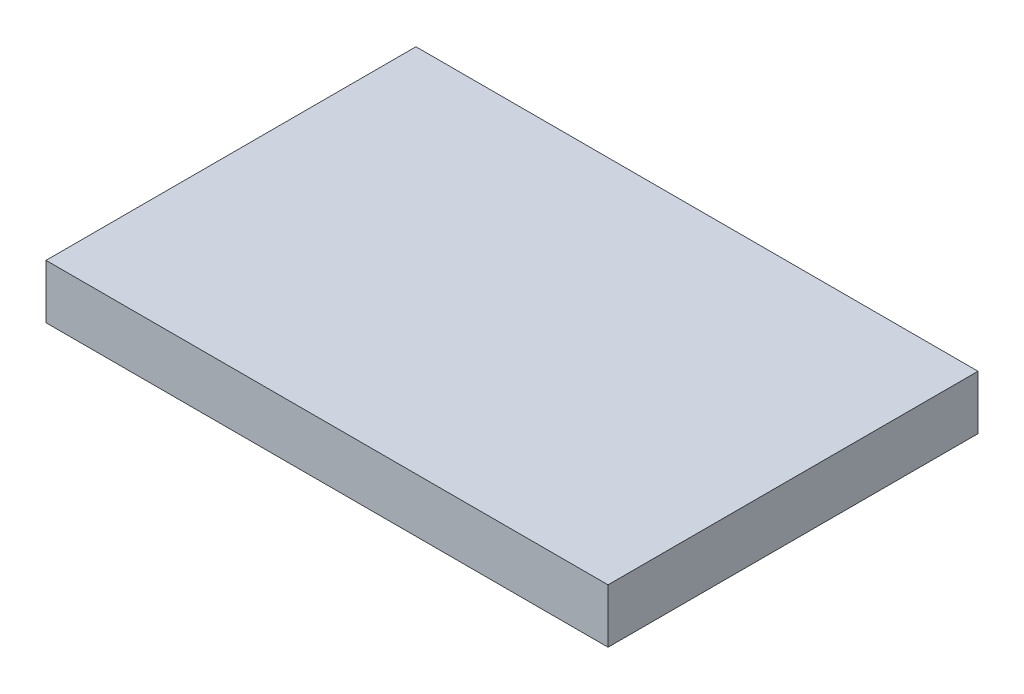
ISO-10303-21;
HEADER;
FILE_DESCRIPTION(('STEP AP214'),'2;1');
FILE_NAME('part.step','',(''),(''),'','','');
FILE_SCHEMA(('AUTOMOTIVE_DESIGN { 1 0 10303 214 1 1 1 1 }'));
ENDSEC;
DATA;
#1=APPLICATION_CONTEXT('core data for automotive mechanical design processes');
#2=APPLICATION_PROTOCOL_DEFINITION('international standard','automotive_design',2000,#1);
#3=PRODUCT_CONTEXT('',#1,'mechanical');
#4=PRODUCT('Part','Part','',(#3));
#5=PRODUCT_RELATED_PRODUCT_CATEGORY('part','',(#4));
#6=PRODUCT_DEFINITION_FORMATION('','',#4);
#7=PRODUCT_DEFINITION_CONTEXT('part definition',#1,'design');
#8=PRODUCT_DEFINITION('design','',#6,#7);
#9=PRODUCT_DEFINITION_SHAPE('','',#8);
#10=(LENGTH_UNIT() NAMED_UNIT(*) SI_UNIT(.MILLI.,.METRE.));
#11=(NAMED_UNIT(*) PLANE_ANGLE_UNIT() SI_UNIT($,.RADIAN.));
#12=(NAMED_UNIT(*) SI_UNIT($,.STERADIAN.) SOLID_ANGLE_UNIT());
#13=UNCERTAINTY_MEASURE_WITH_UNIT(LENGTH_MEASURE(1.E-05),#10,'distance_accuracy_value','');
#14=(GEOMETRIC_REPRESENTATION_CONTEXT(3) GLOBAL_UNCERTAINTY_ASSIGNED_CONTEXT((#13)) GLOBAL_UNIT_ASSIGNED_CONTEXT((#10,
#11,#12)) REPRESENTATION_CONTEXT('',''));
#15=CARTESIAN_POINT('',(0.,0.,0.));
#16=DIRECTION('',(0.,0.,1.));
#17=DIRECTION('',(1.,0.,0.));
#18=AXIS2_PLACEMENT_3D('',#15,#16,#17);
#19=CARTESIAN_POINT('',(197.5,38.,-130.));
#20=DIRECTION('',(-1.,0.,0.));
#21=DIRECTION('',(0.,0.,1.));
#22=AXIS2_PLACEMENT_3D('',#19,#20,#21);
#23=PLANE('',#22);
#24=DIRECTION('',(0.,0.,-1.));
#25=VECTOR('',#24,1.);
#26=CARTESIAN_POINT('',(197.5,0.,-130.));
#27=LINE('',#26,#25);
#28=CARTESIAN_POINT('',(197.5,0.,130.));
#29=VERTEX_POINT('',#28);
#30=CARTESIAN_POINT('',(197.5,0.,-130.));
#31=VERTEX_POINT('',#30);
#32=EDGE_CURVE('E96',#29,#31,#27,.T.);
#33=ORIENTED_EDGE('',*,*,#32,.T.);
#34=DIRECTION('',(0.,-1.,0.));
#35=VECTOR('',#34,1.);
#36=CARTESIAN_POINT('',(197.5,38.,-130.));
#37=LINE('',#36,#35);
#38=CARTESIAN_POINT('',(197.5,38.,-130.));
#39=VERTEX_POINT('',#38);
#40=EDGE_CURVE('E11',#39,#31,#37,.T.);
#41=ORIENTED_EDGE('',*,*,#40,.F.);
#42=DIRECTION('',(0.,0.,-1.));
#43=VECTOR('',#42,1.);
#44=CARTESIAN_POINT('',(197.5,38.,-130.));
#45=LINE('',#44,#43);
#46=CARTESIAN_POINT('',(197.5,38.,130.));
#47=VERTEX_POINT('',#46);
#48=EDGE_CURVE('E84',#47,#39,#45,.T.);
#49=ORIENTED_EDGE('',*,*,#48,.F.);
#50=DIRECTION('',(0.,-1.,0.));
#51=VECTOR('',#50,1.);
#52=CARTESIAN_POINT('',(197.5,38.,130.));
#53=LINE('',#52,#51);
#54=EDGE_CURVE('E92',#47,#29,#53,.T.);
#55=ORIENTED_EDGE('',*,*,#54,.T.);
#56=EDGE_LOOP('',(#33,#41,#49,#55));
#57=FACE_BOUND('',#56,.T.);
#58=ADVANCED_FACE('F33',(#57),#23,.F.);
#59=CARTESIAN_POINT('',(-197.5,38.,-130.));
#60=DIRECTION('',(0.,0.,1.));
#61=DIRECTION('',(1.,0.,0.));
#62=AXIS2_PLACEMENT_3D('',#59,#60,#61);
#63=PLANE('',#62);
#64=DIRECTION('',(-1.,0.,0.));
#65=VECTOR('',#64,1.);
#66=CARTESIAN_POINT('',(-197.5,0.,-130.));
#67=LINE('',#66,#65);
#68=CARTESIAN_POINT('',(-197.5,0.,-130.));
#69=VERTEX_POINT('',#68);
#70=EDGE_CURVE('E88',#31,#69,#67,.T.);
#71=ORIENTED_EDGE('',*,*,#70,.T.);
#72=DIRECTION('',(0.,-1.,0.));
#73=VECTOR('',#72,1.);
#74=CARTESIAN_POINT('',(-197.5,38.,-130.));
#75=LINE('',#74,#73);
#76=CARTESIAN_POINT('',(-197.5,38.,-130.));
#77=VERTEX_POINT('',#76);
#78=EDGE_CURVE('E41',#77,#69,#75,.T.);
#79=ORIENTED_EDGE('',*,*,#78,.F.);
#80=DIRECTION('',(-1.,0.,0.));
#81=VECTOR('',#80,1.);
#82=CARTESIAN_POINT('',(-197.5,38.,-130.));
#83=LINE('',#82,#81);
#84=EDGE_CURVE('E79',#39,#77,#83,.T.);
#85=ORIENTED_EDGE('',*,*,#84,.F.);
#86=ORIENTED_EDGE('',*,*,#40,.T.);
#87=EDGE_LOOP('',(#71,#79,#85,#86));
#88=FACE_BOUND('',#87,.T.);
#89=ADVANCED_FACE('F87',(#88),#63,.F.);
#90=CARTESIAN_POINT('',(-197.5,38.,-130.));
#91=DIRECTION('',(1.,0.,0.));
#92=DIRECTION('',(0.,0.,-1.));
#93=AXIS2_PLACEMENT_3D('',#90,#91,#92);
#94=PLANE('',#93);
#95=DIRECTION('',(0.,0.,1.));
#96=VECTOR('',#95,1.);
#97=CARTESIAN_POINT('',(-197.5,0.,-130.));
#98=LINE('',#97,#96);
#99=CARTESIAN_POINT('',(-197.5,0.,130.));
#100=VERTEX_POINT('',#99);
#101=EDGE_CURVE('E66',#69,#100,#98,.T.);
#102=ORIENTED_EDGE('',*,*,#101,.T.);
#103=DIRECTION('',(0.,-1.,0.));
#104=VECTOR('',#103,1.);
#105=CARTESIAN_POINT('',(-197.5,38.,130.));
#106=LINE('',#105,#104);
#107=CARTESIAN_POINT('',(-197.5,38.,130.));
#108=VERTEX_POINT('',#107);
#109=EDGE_CURVE('E89',#108,#100,#106,.T.);
#110=ORIENTED_EDGE('',*,*,#109,.F.);
#111=DIRECTION('',(0.,0.,1.));
#112=VECTOR('',#111,1.);
#113=CARTESIAN_POINT('',(-197.5,38.,-130.));
#114=LINE('',#113,#112);
#115=EDGE_CURVE('E82',#77,#108,#114,.T.);
#116=ORIENTED_EDGE('',*,*,#115,.F.);
#117=ORIENTED_EDGE('',*,*,#78,.T.);
#118=EDGE_LOOP('',(#102,#110,#116,#117));
#119=FACE_BOUND('',#118,.T.);
#120=ADVANCED_FACE('F90',(#119),#94,.F.);
#121=CARTESIAN_POINT('',(-197.5,38.,130.));
#122=DIRECTION('',(0.,0.,-1.));
#123=DIRECTION('',(-1.,0.,0.));
#124=AXIS2_PLACEMENT_3D('',#121,#122,#123);
#125=PLANE('',#124);
#126=DIRECTION('',(1.,0.,0.));
#127=VECTOR('',#126,1.);
#128=CARTESIAN_POINT('',(-197.5,0.,130.));
#129=LINE('',#128,#127);
#130=EDGE_CURVE('E72',#100,#29,#129,.T.);
#131=ORIENTED_EDGE('',*,*,#130,.T.);
#132=ORIENTED_EDGE('',*,*,#54,.F.);
#133=DIRECTION('',(1.,0.,0.));
#134=VECTOR('',#133,1.);
#135=CARTESIAN_POINT('',(-197.5,38.,130.));
#136=LINE('',#135,#134);
#137=EDGE_CURVE('E49',#108,#47,#136,.T.);
#138=ORIENTED_EDGE('',*,*,#137,.F.);
#139=ORIENTED_EDGE('',*,*,#109,.T.);
#140=EDGE_LOOP('',(#131,#132,#138,#139));
#141=FACE_BOUND('',#140,.T.);
#142=ADVANCED_FACE('F103',(#141),#125,.F.);
#143=CARTESIAN_POINT('',(0.,38.,0.));
#144=DIRECTION('',(0.,1.,0.));
#145=DIRECTION('',(0.,0.,1.));
#146=AXIS2_PLACEMENT_3D('',#143,#144,#145);
#147=PLANE('',#146);
#148=ORIENTED_EDGE('',*,*,#48,.T.);
#149=ORIENTED_EDGE('',*,*,#84,.T.);
#150=ORIENTED_EDGE('',*,*,#115,.T.);
#151=ORIENTED_EDGE('',*,*,#137,.T.);
#152=EDGE_LOOP('',(#148,#149,#150,#151));
#153=FACE_BOUND('',#152,.T.);
#154=ADVANCED_FACE('F80',(#153),#147,.T.);
#155=CARTESIAN_POINT('',(0.,0.,0.));
#156=DIRECTION('',(0.,1.,0.));
#157=DIRECTION('',(0.,0.,1.));
#158=AXIS2_PLACEMENT_3D('',#155,#156,#157);
#159=PLANE('',#158);
#160=ORIENTED_EDGE('',*,*,#32,.F.);
#161=ORIENTED_EDGE('',*,*,#130,.F.);
#162=ORIENTED_EDGE('',*,*,#101,.F.);
#163=ORIENTED_EDGE('',*,*,#70,.F.);
#164=EDGE_LOOP('',(#160,#161,#162,#163));
#165=FACE_BOUND('',#164,.T.);
#166=ADVANCED_FACE('F106',(#165),#159,.F.);
#167=CLOSED_SHELL('',(#58,#89,#120,#142,#154,#166));
#168=MANIFOLD_SOLID_BREP('B2',#167);
#169=ADVANCED_BREP_SHAPE_REPRESENTATION('',(#18,#168),#14);
#170=SHAPE_DEFINITION_REPRESENTATION(#9,#169);
ENDSEC;
END-ISO-10303-21;
